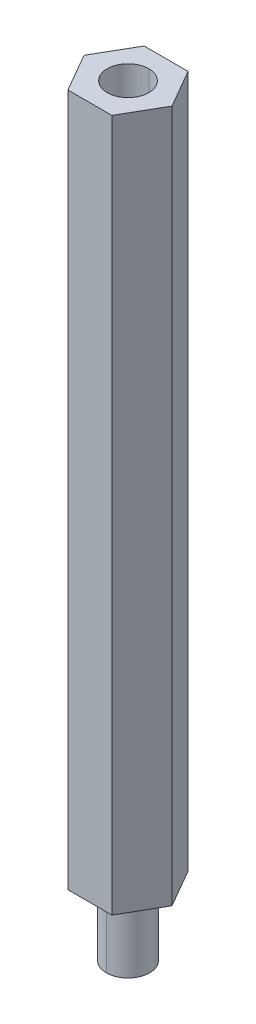
ISO-10303-21;
HEADER;
FILE_DESCRIPTION(('STEP AP214'),'2;1');
FILE_NAME('part.step','',(''),(''),'','','');
FILE_SCHEMA(('AUTOMOTIVE_DESIGN { 1 0 10303 214 1 1 1 1 }'));
ENDSEC;
DATA;
#1=APPLICATION_CONTEXT('core data for automotive mechanical design processes');
#2=APPLICATION_PROTOCOL_DEFINITION('international standard','automotive_design',2000,#1);
#3=PRODUCT_CONTEXT('',#1,'mechanical');
#4=PRODUCT('Part','Part','',(#3));
#5=PRODUCT_RELATED_PRODUCT_CATEGORY('part','',(#4));
#6=PRODUCT_DEFINITION_FORMATION('','',#4);
#7=PRODUCT_DEFINITION_CONTEXT('part definition',#1,'design');
#8=PRODUCT_DEFINITION('design','',#6,#7);
#9=PRODUCT_DEFINITION_SHAPE('','',#8);
#10=(LENGTH_UNIT() NAMED_UNIT(*) SI_UNIT(.MILLI.,.METRE.));
#11=(NAMED_UNIT(*) PLANE_ANGLE_UNIT() SI_UNIT($,.RADIAN.));
#12=(NAMED_UNIT(*) SI_UNIT($,.STERADIAN.) SOLID_ANGLE_UNIT());
#13=UNCERTAINTY_MEASURE_WITH_UNIT(LENGTH_MEASURE(1.E-05),#10,'distance_accuracy_value','');
#14=(GEOMETRIC_REPRESENTATION_CONTEXT(3) GLOBAL_UNCERTAINTY_ASSIGNED_CONTEXT((#13)) GLOBAL_UNIT_ASSIGNED_CONTEXT((#10,
#11,#12)) REPRESENTATION_CONTEXT('',''));
#15=CARTESIAN_POINT('',(0.,0.,0.));
#16=DIRECTION('',(0.,0.,1.));
#17=DIRECTION('',(1.,0.,0.));
#18=AXIS2_PLACEMENT_3D('',#15,#16,#17);
#19=CARTESIAN_POINT('',(0.,-5.,0.));
#20=DIRECTION('',(0.,1.,0.));
#21=DIRECTION('',(0.,0.,1.));
#22=AXIS2_PLACEMENT_3D('',#19,#20,#21);
#23=CYLINDRICAL_SURFACE('',#22,1.56);
#24=CARTESIAN_POINT('',(0.,-5.,0.));
#25=DIRECTION('',(0.,-1.,0.));
#26=DIRECTION('',(0.,0.,-1.));
#27=AXIS2_PLACEMENT_3D('',#24,#25,#26);
#28=CIRCLE('',#27,1.56);
#29=CARTESIAN_POINT('',(0.,-5.,-1.56));
#30=VERTEX_POINT('',#29);
#31=CARTESIAN_POINT('',(0.,-5.,1.56));
#32=VERTEX_POINT('',#31);
#33=EDGE_CURVE('E39',#30,#32,#28,.T.);
#34=ORIENTED_EDGE('',*,*,#33,.F.);
#35=DIRECTION('',(0.,1.,0.));
#36=VECTOR('',#35,1.);
#37=CARTESIAN_POINT('',(0.,-5.,-1.56));
#38=LINE('',#37,#36);
#39=CARTESIAN_POINT('',(0.,0.,-1.56));
#40=VERTEX_POINT('',#39);
#41=EDGE_CURVE('E11',#30,#40,#38,.T.);
#42=ORIENTED_EDGE('',*,*,#41,.T.);
#43=CARTESIAN_POINT('',(0.,0.,0.));
#44=DIRECTION('',(0.,-1.,0.));
#45=DIRECTION('',(0.,0.,-1.));
#46=AXIS2_PLACEMENT_3D('',#43,#44,#45);
#47=CIRCLE('',#46,1.56);
#48=CARTESIAN_POINT('',(0.,0.,1.56));
#49=VERTEX_POINT('',#48);
#50=EDGE_CURVE('E26',#40,#49,#47,.T.);
#51=ORIENTED_EDGE('',*,*,#50,.T.);
#52=DIRECTION('',(0.,1.,0.));
#53=VECTOR('',#52,1.);
#54=CARTESIAN_POINT('',(0.,-5.,1.56));
#55=LINE('',#54,#53);
#56=EDGE_CURVE('E164',#32,#49,#55,.T.);
#57=ORIENTED_EDGE('',*,*,#56,.F.);
#58=EDGE_LOOP('',(#34,#42,#51,#57));
#59=FACE_BOUND('',#58,.T.);
#60=ADVANCED_FACE('F16',(#59),#23,.T.);
#61=CARTESIAN_POINT('',(0.,40.,0.));
#62=DIRECTION('',(0.,1.,0.));
#63=DIRECTION('',(0.,0.,1.));
#64=AXIS2_PLACEMENT_3D('',#61,#62,#63);
#65=CYLINDRICAL_SURFACE('',#64,1.5);
#66=CARTESIAN_POINT('',(0.,40.,0.));
#67=DIRECTION('',(0.,1.,0.));
#68=DIRECTION('',(0.,0.,1.));
#69=AXIS2_PLACEMENT_3D('',#66,#67,#68);
#70=CIRCLE('',#69,1.5);
#71=CARTESIAN_POINT('',(0.,40.,-1.5));
#72=VERTEX_POINT('',#71);
#73=CARTESIAN_POINT('',(0.,40.,1.5));
#74=VERTEX_POINT('',#73);
#75=EDGE_CURVE('E166',#72,#74,#70,.T.);
#76=ORIENTED_EDGE('',*,*,#75,.F.);
#77=DIRECTION('',(0.,1.,0.));
#78=VECTOR('',#77,1.);
#79=CARTESIAN_POINT('',(0.,40.,-1.5));
#80=LINE('',#79,#78);
#81=CARTESIAN_POINT('',(0.,50.,-1.5));
#82=VERTEX_POINT('',#81);
#83=EDGE_CURVE('E211',#72,#82,#80,.T.);
#84=ORIENTED_EDGE('',*,*,#83,.T.);
#85=CARTESIAN_POINT('',(0.,50.,0.));
#86=DIRECTION('',(0.,1.,0.));
#87=DIRECTION('',(0.,0.,1.));
#88=AXIS2_PLACEMENT_3D('',#85,#86,#87);
#89=CIRCLE('',#88,1.5);
#90=CARTESIAN_POINT('',(0.,50.,1.5));
#91=VERTEX_POINT('',#90);
#92=EDGE_CURVE('E143',#82,#91,#89,.T.);
#93=ORIENTED_EDGE('',*,*,#92,.T.);
#94=DIRECTION('',(0.,1.,0.));
#95=VECTOR('',#94,1.);
#96=CARTESIAN_POINT('',(0.,40.,1.5));
#97=LINE('',#96,#95);
#98=EDGE_CURVE('E204',#74,#91,#97,.T.);
#99=ORIENTED_EDGE('',*,*,#98,.F.);
#100=EDGE_LOOP('',(#76,#84,#93,#99));
#101=FACE_BOUND('',#100,.T.);
#102=ADVANCED_FACE('F266',(#101),#65,.F.);
#103=CARTESIAN_POINT('',(1.5877132402715,50.,2.75));
#104=DIRECTION('',(-0.866025403784442,0.,-0.5));
#105=DIRECTION('',(-0.5,0.,0.866025403784442));
#106=AXIS2_PLACEMENT_3D('',#103,#104,#105);
#107=PLANE('',#106);
#108=DIRECTION('',(0.5,0.,-0.866025403784442));
#109=VECTOR('',#108,1.);
#110=CARTESIAN_POINT('',(1.5877132402715,0.,2.75));
#111=LINE('',#110,#109);
#112=CARTESIAN_POINT('',(1.5877132402715,0.,2.75));
#113=VERTEX_POINT('',#112);
#114=CARTESIAN_POINT('',(3.17542648054293,0.,0.));
#115=VERTEX_POINT('',#114);
#116=EDGE_CURVE('E125',#113,#115,#111,.T.);
#117=ORIENTED_EDGE('',*,*,#116,.T.);
#118=DIRECTION('',(0.,-1.,0.));
#119=VECTOR('',#118,1.);
#120=CARTESIAN_POINT('',(3.17542648054293,50.,0.));
#121=LINE('',#120,#119);
#122=CARTESIAN_POINT('',(3.17542648054293,50.,0.));
#123=VERTEX_POINT('',#122);
#124=EDGE_CURVE('E227',#123,#115,#121,.T.);
#125=ORIENTED_EDGE('',*,*,#124,.F.);
#126=DIRECTION('',(0.5,0.,-0.866025403784442));
#127=VECTOR('',#126,1.);
#128=CARTESIAN_POINT('',(1.5877132402715,50.,2.75));
#129=LINE('',#128,#127);
#130=CARTESIAN_POINT('',(1.5877132402715,50.,2.75));
#131=VERTEX_POINT('',#130);
#132=EDGE_CURVE('E127',#131,#123,#129,.T.);
#133=ORIENTED_EDGE('',*,*,#132,.F.);
#134=DIRECTION('',(0.,-1.,0.));
#135=VECTOR('',#134,1.);
#136=CARTESIAN_POINT('',(1.5877132402715,50.,2.75));
#137=LINE('',#136,#135);
#138=EDGE_CURVE('E121',#131,#113,#137,.T.);
#139=ORIENTED_EDGE('',*,*,#138,.T.);
#140=EDGE_LOOP('',(#117,#125,#133,#139));
#141=FACE_BOUND('',#140,.T.);
#142=ADVANCED_FACE('F123',(#141),#107,.F.);
#143=CARTESIAN_POINT('',(3.17542648054293,50.,0.));
#144=DIRECTION('',(-0.866025403784438,0.,0.5));
#145=DIRECTION('',(0.,1.,0.));
#146=AXIS2_PLACEMENT_3D('',#143,#144,#145);
#147=PLANE('',#146);
#148=DIRECTION('',(-0.5,0.,-0.866025403784438));
#149=VECTOR('',#148,1.);
#150=CARTESIAN_POINT('',(3.17542648054293,0.,0.));
#151=LINE('',#150,#149);
#152=CARTESIAN_POINT('',(1.58771324027146,0.,-2.75));
#153=VERTEX_POINT('',#152);
#154=EDGE_CURVE('E133',#115,#153,#151,.T.);
#155=ORIENTED_EDGE('',*,*,#154,.T.);
#156=DIRECTION('',(0.,-1.,0.));
#157=VECTOR('',#156,1.);
#158=CARTESIAN_POINT('',(1.58771324027146,50.,-2.75));
#159=LINE('',#158,#157);
#160=CARTESIAN_POINT('',(1.58771324027146,50.,-2.75));
#161=VERTEX_POINT('',#160);
#162=EDGE_CURVE('E112',#161,#153,#159,.T.);
#163=ORIENTED_EDGE('',*,*,#162,.F.);
#164=DIRECTION('',(-0.5,0.,-0.866025403784438));
#165=VECTOR('',#164,1.);
#166=CARTESIAN_POINT('',(3.17542648054293,50.,0.));
#167=LINE('',#166,#165);
#168=EDGE_CURVE('E173',#123,#161,#167,.T.);
#169=ORIENTED_EDGE('',*,*,#168,.F.);
#170=ORIENTED_EDGE('',*,*,#124,.T.);
#171=EDGE_LOOP('',(#155,#163,#169,#170));
#172=FACE_BOUND('',#171,.T.);
#173=ADVANCED_FACE('F275',(#172),#147,.F.);
#174=CARTESIAN_POINT('',(1.58771324027146,50.,-2.75));
#175=DIRECTION('',(0.,0.,1.));
#176=DIRECTION('',(1.,0.,0.));
#177=AXIS2_PLACEMENT_3D('',#174,#175,#176);
#178=PLANE('',#177);
#179=DIRECTION('',(-1.,0.,0.));
#180=VECTOR('',#179,1.);
#181=CARTESIAN_POINT('',(1.58771324027146,0.,-2.75));
#182=LINE('',#181,#180);
#183=CARTESIAN_POINT('',(-1.58771324027148,0.,-2.75));
#184=VERTEX_POINT('',#183);
#185=EDGE_CURVE('E229',#153,#184,#182,.T.);
#186=ORIENTED_EDGE('',*,*,#185,.T.);
#187=DIRECTION('',(0.,-1.,0.));
#188=VECTOR('',#187,1.);
#189=CARTESIAN_POINT('',(-1.58771324027148,50.,-2.75));
#190=LINE('',#189,#188);
#191=CARTESIAN_POINT('',(-1.58771324027148,50.,-2.75));
#192=VERTEX_POINT('',#191);
#193=EDGE_CURVE('E199',#192,#184,#190,.T.);
#194=ORIENTED_EDGE('',*,*,#193,.F.);
#195=DIRECTION('',(-1.,0.,0.));
#196=VECTOR('',#195,1.);
#197=CARTESIAN_POINT('',(1.58771324027146,50.,-2.75));
#198=LINE('',#197,#196);
#199=EDGE_CURVE('E171',#161,#192,#198,.T.);
#200=ORIENTED_EDGE('',*,*,#199,.F.);
#201=ORIENTED_EDGE('',*,*,#162,.T.);
#202=EDGE_LOOP('',(#186,#194,#200,#201));
#203=FACE_BOUND('',#202,.T.);
#204=ADVANCED_FACE('F278',(#203),#178,.F.);
#205=CARTESIAN_POINT('',(-1.58771324027148,50.,-2.75));
#206=DIRECTION('',(0.866025403784442,0.,0.5));
#207=DIRECTION('',(0.,-1.,0.));
#208=AXIS2_PLACEMENT_3D('',#205,#206,#207);
#209=PLANE('',#208);
#210=DIRECTION('',(-0.5,0.,0.866025403784442));
#211=VECTOR('',#210,1.);
#212=CARTESIAN_POINT('',(-1.58771324027148,0.,-2.75));
#213=LINE('',#212,#211);
#214=CARTESIAN_POINT('',(-3.17542648054293,0.,0.));
#215=VERTEX_POINT('',#214);
#216=EDGE_CURVE('E193',#184,#215,#213,.T.);
#217=ORIENTED_EDGE('',*,*,#216,.T.);
#218=DIRECTION('',(0.,-1.,0.));
#219=VECTOR('',#218,1.);
#220=CARTESIAN_POINT('',(-3.17542648054293,50.,0.));
#221=LINE('',#220,#219);
#222=CARTESIAN_POINT('',(-3.17542648054293,50.,0.));
#223=VERTEX_POINT('',#222);
#224=EDGE_CURVE('E150',#223,#215,#221,.T.);
#225=ORIENTED_EDGE('',*,*,#224,.F.);
#226=DIRECTION('',(-0.5,0.,0.866025403784442));
#227=VECTOR('',#226,1.);
#228=CARTESIAN_POINT('',(-1.58771324027148,50.,-2.75));
#229=LINE('',#228,#227);
#230=EDGE_CURVE('E168',#192,#223,#229,.T.);
#231=ORIENTED_EDGE('',*,*,#230,.F.);
#232=ORIENTED_EDGE('',*,*,#193,.T.);
#233=EDGE_LOOP('',(#217,#225,#231,#232));
#234=FACE_BOUND('',#233,.T.);
#235=ADVANCED_FACE('F282',(#234),#209,.F.);
#236=CARTESIAN_POINT('',(-3.17542648054293,50.,0.));
#237=DIRECTION('',(0.866025403784435,0.,-0.500000000000007));
#238=DIRECTION('',(0.,-1.,0.));
#239=AXIS2_PLACEMENT_3D('',#236,#237,#238);
#240=PLANE('',#239);
#241=DIRECTION('',(0.500000000000007,0.,0.866025403784435));
#242=VECTOR('',#241,1.);
#243=CARTESIAN_POINT('',(-3.17542648054293,0.,0.));
#244=LINE('',#243,#242);
#245=CARTESIAN_POINT('',(-1.58771324027144,0.,2.75));
#246=VERTEX_POINT('',#245);
#247=EDGE_CURVE('E158',#215,#246,#244,.T.);
#248=ORIENTED_EDGE('',*,*,#247,.T.);
#249=DIRECTION('',(0.,-1.,0.));
#250=VECTOR('',#249,1.);
#251=CARTESIAN_POINT('',(-1.58771324027144,50.,2.75));
#252=LINE('',#251,#250);
#253=CARTESIAN_POINT('',(-1.58771324027144,50.,2.75));
#254=VERTEX_POINT('',#253);
#255=EDGE_CURVE('E147',#254,#246,#252,.T.);
#256=ORIENTED_EDGE('',*,*,#255,.F.);
#257=DIRECTION('',(0.500000000000007,0.,0.866025403784435));
#258=VECTOR('',#257,1.);
#259=CARTESIAN_POINT('',(-3.17542648054293,50.,0.));
#260=LINE('',#259,#258);
#261=EDGE_CURVE('E172',#223,#254,#260,.T.);
#262=ORIENTED_EDGE('',*,*,#261,.F.);
#263=ORIENTED_EDGE('',*,*,#224,.T.);
#264=EDGE_LOOP('',(#248,#256,#262,#263));
#265=FACE_BOUND('',#264,.T.);
#266=ADVANCED_FACE('F283',(#265),#240,.F.);
#267=CARTESIAN_POINT('',(-1.58771324027144,50.,2.75));
#268=DIRECTION('',(0.,0.,-1.));
#269=DIRECTION('',(-1.,0.,0.));
#270=AXIS2_PLACEMENT_3D('',#267,#268,#269);
#271=PLANE('',#270);
#272=DIRECTION('',(1.,0.,0.));
#273=VECTOR('',#272,1.);
#274=CARTESIAN_POINT('',(-1.58771324027144,0.,2.75));
#275=LINE('',#274,#273);
#276=EDGE_CURVE('E140',#246,#113,#275,.T.);
#277=ORIENTED_EDGE('',*,*,#276,.T.);
#278=ORIENTED_EDGE('',*,*,#138,.F.);
#279=DIRECTION('',(1.,0.,0.));
#280=VECTOR('',#279,1.);
#281=CARTESIAN_POINT('',(-1.58771324027144,50.,2.75));
#282=LINE('',#281,#280);
#283=EDGE_CURVE('E213',#254,#131,#282,.T.);
#284=ORIENTED_EDGE('',*,*,#283,.F.);
#285=ORIENTED_EDGE('',*,*,#255,.T.);
#286=EDGE_LOOP('',(#277,#278,#284,#285));
#287=FACE_BOUND('',#286,.T.);
#288=ADVANCED_FACE('F145',(#287),#271,.F.);
#289=CARTESIAN_POINT('',(0.,50.,0.));
#290=DIRECTION('',(0.,1.,0.));
#291=DIRECTION('',(1.,0.,0.));
#292=AXIS2_PLACEMENT_3D('',#289,#290,#291);
#293=PLANE('',#292);
#294=ORIENTED_EDGE('',*,*,#132,.T.);
#295=ORIENTED_EDGE('',*,*,#168,.T.);
#296=ORIENTED_EDGE('',*,*,#199,.T.);
#297=ORIENTED_EDGE('',*,*,#230,.T.);
#298=ORIENTED_EDGE('',*,*,#261,.T.);
#299=ORIENTED_EDGE('',*,*,#283,.T.);
#300=EDGE_LOOP('',(#294,#295,#296,#297,#298,#299));
#301=FACE_BOUND('',#300,.T.);
#302=CARTESIAN_POINT('',(0.,50.,0.));
#303=DIRECTION('',(0.,1.,0.));
#304=DIRECTION('',(0.,0.,1.));
#305=AXIS2_PLACEMENT_3D('',#302,#303,#304);
#306=CIRCLE('',#305,1.5);
#307=EDGE_CURVE('E200',#91,#82,#306,.T.);
#308=ORIENTED_EDGE('',*,*,#307,.F.);
#309=ORIENTED_EDGE('',*,*,#92,.F.);
#310=EDGE_LOOP('',(#308,#309));
#311=FACE_BOUND('',#310,.T.);
#312=ADVANCED_FACE('F291',(#301,#311),#293,.T.);
#313=CARTESIAN_POINT('',(0.,0.,0.));
#314=DIRECTION('',(0.,1.,0.));
#315=DIRECTION('',(1.,0.,0.));
#316=AXIS2_PLACEMENT_3D('',#313,#314,#315);
#317=PLANE('',#316);
#318=ORIENTED_EDGE('',*,*,#116,.F.);
#319=ORIENTED_EDGE('',*,*,#276,.F.);
#320=ORIENTED_EDGE('',*,*,#247,.F.);
#321=ORIENTED_EDGE('',*,*,#216,.F.);
#322=ORIENTED_EDGE('',*,*,#185,.F.);
#323=ORIENTED_EDGE('',*,*,#154,.F.);
#324=EDGE_LOOP('',(#318,#319,#320,#321,#322,#323));
#325=FACE_BOUND('',#324,.T.);
#326=CARTESIAN_POINT('',(0.,0.,0.));
#327=DIRECTION('',(0.,-1.,0.));
#328=DIRECTION('',(0.,0.,-1.));
#329=AXIS2_PLACEMENT_3D('',#326,#327,#328);
#330=CIRCLE('',#329,1.56);
#331=EDGE_CURVE('E167',#49,#40,#330,.T.);
#332=ORIENTED_EDGE('',*,*,#331,.F.);
#333=ORIENTED_EDGE('',*,*,#50,.F.);
#334=EDGE_LOOP('',(#332,#333));
#335=FACE_BOUND('',#334,.T.);
#336=ADVANCED_FACE('F137',(#325,#335),#317,.F.);
#337=CARTESIAN_POINT('',(0.,40.,0.));
#338=DIRECTION('',(0.,1.,0.));
#339=DIRECTION('',(0.,0.,1.));
#340=AXIS2_PLACEMENT_3D('',#337,#338,#339);
#341=CYLINDRICAL_SURFACE('',#340,1.5);
#342=ORIENTED_EDGE('',*,*,#83,.F.);
#343=CARTESIAN_POINT('',(0.,40.,0.));
#344=DIRECTION('',(0.,1.,0.));
#345=DIRECTION('',(0.,0.,1.));
#346=AXIS2_PLACEMENT_3D('',#343,#344,#345);
#347=CIRCLE('',#346,1.5);
#348=EDGE_CURVE('E205',#74,#72,#347,.T.);
#349=ORIENTED_EDGE('',*,*,#348,.F.);
#350=ORIENTED_EDGE('',*,*,#98,.T.);
#351=ORIENTED_EDGE('',*,*,#307,.T.);
#352=EDGE_LOOP('',(#342,#349,#350,#351));
#353=FACE_BOUND('',#352,.T.);
#354=ADVANCED_FACE('F263',(#353),#341,.F.);
#355=CARTESIAN_POINT('',(0.,40.,0.));
#356=DIRECTION('',(0.,1.,0.));
#357=DIRECTION('',(1.,0.,0.));
#358=AXIS2_PLACEMENT_3D('',#355,#356,#357);
#359=PLANE('',#358);
#360=ORIENTED_EDGE('',*,*,#348,.T.);
#361=ORIENTED_EDGE('',*,*,#75,.T.);
#362=EDGE_LOOP('',(#360,#361));
#363=FACE_BOUND('',#362,.T.);
#364=ADVANCED_FACE('F256',(#363),#359,.T.);
#365=CARTESIAN_POINT('',(0.,-5.,0.));
#366=DIRECTION('',(0.,1.,0.));
#367=DIRECTION('',(0.,0.,1.));
#368=AXIS2_PLACEMENT_3D('',#365,#366,#367);
#369=CYLINDRICAL_SURFACE('',#368,1.56);
#370=ORIENTED_EDGE('',*,*,#41,.F.);
#371=CARTESIAN_POINT('',(0.,-5.,0.));
#372=DIRECTION('',(0.,-1.,0.));
#373=DIRECTION('',(0.,0.,-1.));
#374=AXIS2_PLACEMENT_3D('',#371,#372,#373);
#375=CIRCLE('',#374,1.56);
#376=EDGE_CURVE('E175',#32,#30,#375,.T.);
#377=ORIENTED_EDGE('',*,*,#376,.F.);
#378=ORIENTED_EDGE('',*,*,#56,.T.);
#379=ORIENTED_EDGE('',*,*,#331,.T.);
#380=EDGE_LOOP('',(#370,#377,#378,#379));
#381=FACE_BOUND('',#380,.T.);
#382=ADVANCED_FACE('F18',(#381),#369,.T.);
#383=CARTESIAN_POINT('',(0.,-5.,0.));
#384=DIRECTION('',(0.,-1.,0.));
#385=DIRECTION('',(0.,0.,-1.));
#386=AXIS2_PLACEMENT_3D('',#383,#384,#385);
#387=PLANE('',#386);
#388=ORIENTED_EDGE('',*,*,#376,.T.);
#389=ORIENTED_EDGE('',*,*,#33,.T.);
#390=EDGE_LOOP('',(#388,#389));
#391=FACE_BOUND('',#390,.T.);
#392=ADVANCED_FACE('F255',(#391),#387,.T.);
#393=CLOSED_SHELL('',(#60,#102,#142,#173,#204,#235,#266,#288,#312,#336,#354,#364,#382,#392));
#394=MANIFOLD_SOLID_BREP('B1',#393);
#395=ADVANCED_BREP_SHAPE_REPRESENTATION('',(#18,#394),#14);
#396=SHAPE_DEFINITION_REPRESENTATION(#9,#395);
ENDSEC;
END-ISO-10303-21;
